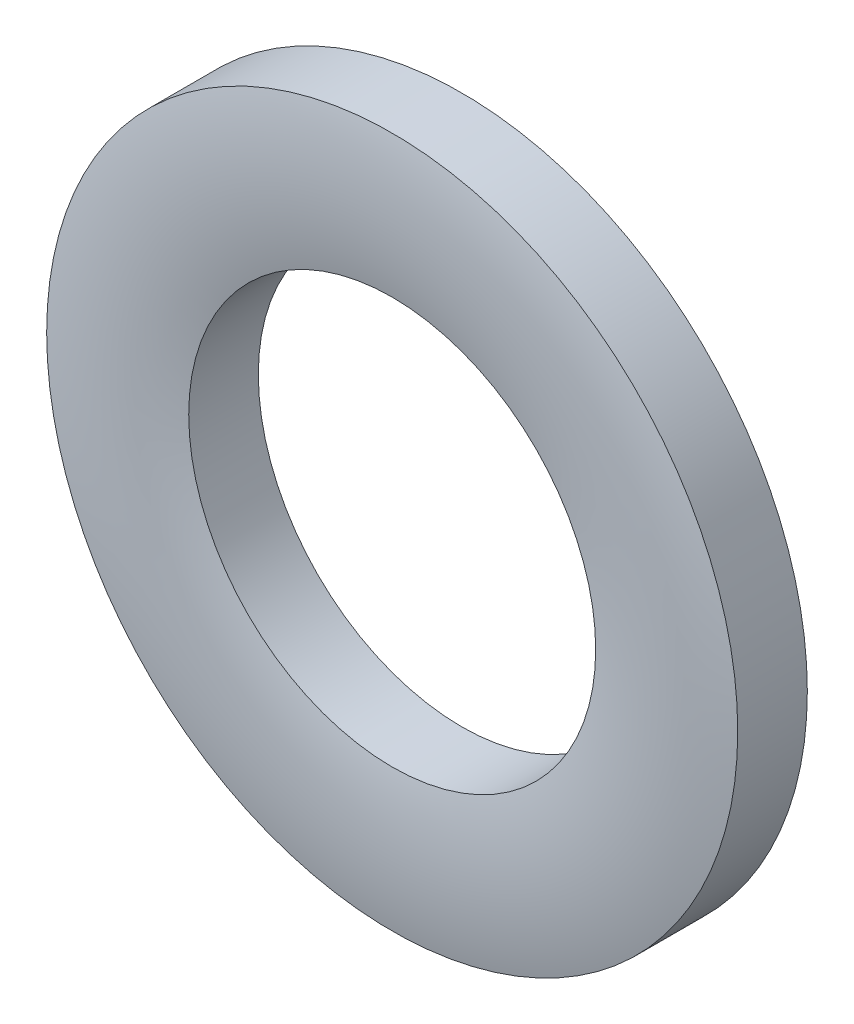
ISO-10303-21;
HEADER;
FILE_DESCRIPTION(('STEP AP214'),'2;1');
FILE_NAME('part.step','',(''),(''),'','','');
FILE_SCHEMA(('AUTOMOTIVE_DESIGN { 1 0 10303 214 1 1 1 1 }'));
ENDSEC;
DATA;
#1=APPLICATION_CONTEXT('core data for automotive mechanical design processes');
#2=APPLICATION_PROTOCOL_DEFINITION('international standard','automotive_design',2000,#1);
#3=PRODUCT_CONTEXT('',#1,'mechanical');
#4=PRODUCT('Part','Part','',(#3));
#5=PRODUCT_RELATED_PRODUCT_CATEGORY('part','',(#4));
#6=PRODUCT_DEFINITION_FORMATION('','',#4);
#7=PRODUCT_DEFINITION_CONTEXT('part definition',#1,'design');
#8=PRODUCT_DEFINITION('design','',#6,#7);
#9=PRODUCT_DEFINITION_SHAPE('','',#8);
#10=(LENGTH_UNIT() NAMED_UNIT(*) SI_UNIT(.MILLI.,.METRE.));
#11=(NAMED_UNIT(*) PLANE_ANGLE_UNIT() SI_UNIT($,.RADIAN.));
#12=(NAMED_UNIT(*) SI_UNIT($,.STERADIAN.) SOLID_ANGLE_UNIT());
#13=UNCERTAINTY_MEASURE_WITH_UNIT(LENGTH_MEASURE(1.E-05),#10,'distance_accuracy_value','');
#14=(GEOMETRIC_REPRESENTATION_CONTEXT(3) GLOBAL_UNCERTAINTY_ASSIGNED_CONTEXT((#13)) GLOBAL_UNIT_ASSIGNED_CONTEXT((#10,
#11,#12)) REPRESENTATION_CONTEXT('',''));
#15=CARTESIAN_POINT('',(0.,0.,0.));
#16=DIRECTION('',(0.,0.,1.));
#17=DIRECTION('',(1.,0.,0.));
#18=AXIS2_PLACEMENT_3D('',#15,#16,#17);
#19=CARTESIAN_POINT('',(0.,2.65,-0.5));
#20=DIRECTION('',(0.,0.,1.));
#21=DIRECTION('',(1.,0.,0.));
#22=AXIS2_PLACEMENT_3D('',#19,#20,#21);
#23=PLANE('',#22);
#24=CARTESIAN_POINT('',(0.,0.,-0.5));
#25=DIRECTION('',(0.,0.,1.));
#26=DIRECTION('',(1.,0.,0.));
#27=AXIS2_PLACEMENT_3D('',#24,#25,#26);
#28=CIRCLE('',#27,4.5);
#29=CARTESIAN_POINT('',(4.5,0.,-0.5));
#30=VERTEX_POINT('',#29);
#31=EDGE_CURVE('E51',#30,#30,#28,.T.);
#32=ORIENTED_EDGE('',*,*,#31,.F.);
#33=EDGE_LOOP('',(#32));
#34=FACE_BOUND('',#33,.T.);
#35=CARTESIAN_POINT('',(0.,0.,-0.5));
#36=DIRECTION('',(0.,0.,1.));
#37=DIRECTION('',(1.,0.,0.));
#38=AXIS2_PLACEMENT_3D('',#35,#36,#37);
#39=CIRCLE('',#38,2.65);
#40=CARTESIAN_POINT('',(2.65,0.,-0.5));
#41=VERTEX_POINT('',#40);
#42=EDGE_CURVE('E10',#41,#41,#39,.T.);
#43=ORIENTED_EDGE('',*,*,#42,.T.);
#44=EDGE_LOOP('',(#43));
#45=FACE_BOUND('',#44,.T.);
#46=ADVANCED_FACE('F37',(#34,#45),#23,.F.);
#47=CARTESIAN_POINT('',(0.,0.,0.5));
#48=DIRECTION('',(0.,0.,1.));
#49=DIRECTION('',(1.,0.,0.));
#50=AXIS2_PLACEMENT_3D('',#47,#48,#49);
#51=CYLINDRICAL_SURFACE('',#50,2.65);
#52=ORIENTED_EDGE('',*,*,#42,.F.);
#53=EDGE_LOOP('',(#52));
#54=FACE_BOUND('',#53,.T.);
#55=CARTESIAN_POINT('',(0.,0.,0.4063));
#56=DIRECTION('',(0.,0.,1.));
#57=DIRECTION('',(1.,0.,0.));
#58=AXIS2_PLACEMENT_3D('',#55,#56,#57);
#59=CIRCLE('',#58,2.65);
#60=CARTESIAN_POINT('',(2.65,0.,0.4063));
#61=VERTEX_POINT('',#60);
#62=EDGE_CURVE('E43',#61,#61,#59,.T.);
#63=ORIENTED_EDGE('',*,*,#62,.T.);
#64=EDGE_LOOP('',(#63));
#65=FACE_BOUND('',#64,.T.);
#66=ADVANCED_FACE('F60',(#54,#65),#51,.F.);
#67=CARTESIAN_POINT('',(0.,0.,-4.11261840981858));
#68=DIRECTION('',(0.,0.,1.));
#69=DIRECTION('',(1.,0.,0.));
#70=AXIS2_PLACEMENT_3D('',#67,#68,#69);
#71=DEGENERATE_TOROIDAL_SURFACE('',#70,3.575,4.61261840981858,.T.);
#72=ORIENTED_EDGE('',*,*,#62,.F.);
#73=EDGE_LOOP('',(#72));
#74=FACE_BOUND('',#73,.T.);
#75=CARTESIAN_POINT('',(0.,0.,0.4063));
#76=DIRECTION('',(0.,0.,1.));
#77=DIRECTION('',(1.,0.,0.));
#78=AXIS2_PLACEMENT_3D('',#75,#76,#77);
#79=CIRCLE('',#78,4.5);
#80=CARTESIAN_POINT('',(4.5,0.,0.4063));
#81=VERTEX_POINT('',#80);
#82=EDGE_CURVE('E47',#81,#81,#79,.T.);
#83=ORIENTED_EDGE('',*,*,#82,.T.);
#84=EDGE_LOOP('',(#83));
#85=FACE_BOUND('',#84,.T.);
#86=ADVANCED_FACE('F64',(#74,#85),#71,.T.);
#87=CARTESIAN_POINT('',(0.,0.,0.5));
#88=DIRECTION('',(0.,0.,1.));
#89=DIRECTION('',(1.,0.,0.));
#90=AXIS2_PLACEMENT_3D('',#87,#88,#89);
#91=CYLINDRICAL_SURFACE('',#90,4.5);
#92=ORIENTED_EDGE('',*,*,#82,.F.);
#93=EDGE_LOOP('',(#92));
#94=FACE_BOUND('',#93,.T.);
#95=ORIENTED_EDGE('',*,*,#31,.T.);
#96=EDGE_LOOP('',(#95));
#97=FACE_BOUND('',#96,.T.);
#98=ADVANCED_FACE('F57',(#94,#97),#91,.T.);
#99=CLOSED_SHELL('',(#46,#66,#86,#98));
#100=MANIFOLD_SOLID_BREP('B2',#99);
#101=ADVANCED_BREP_SHAPE_REPRESENTATION('',(#18,#100),#14);
#102=SHAPE_DEFINITION_REPRESENTATION(#9,#101);
ENDSEC;
END-ISO-10303-21;
